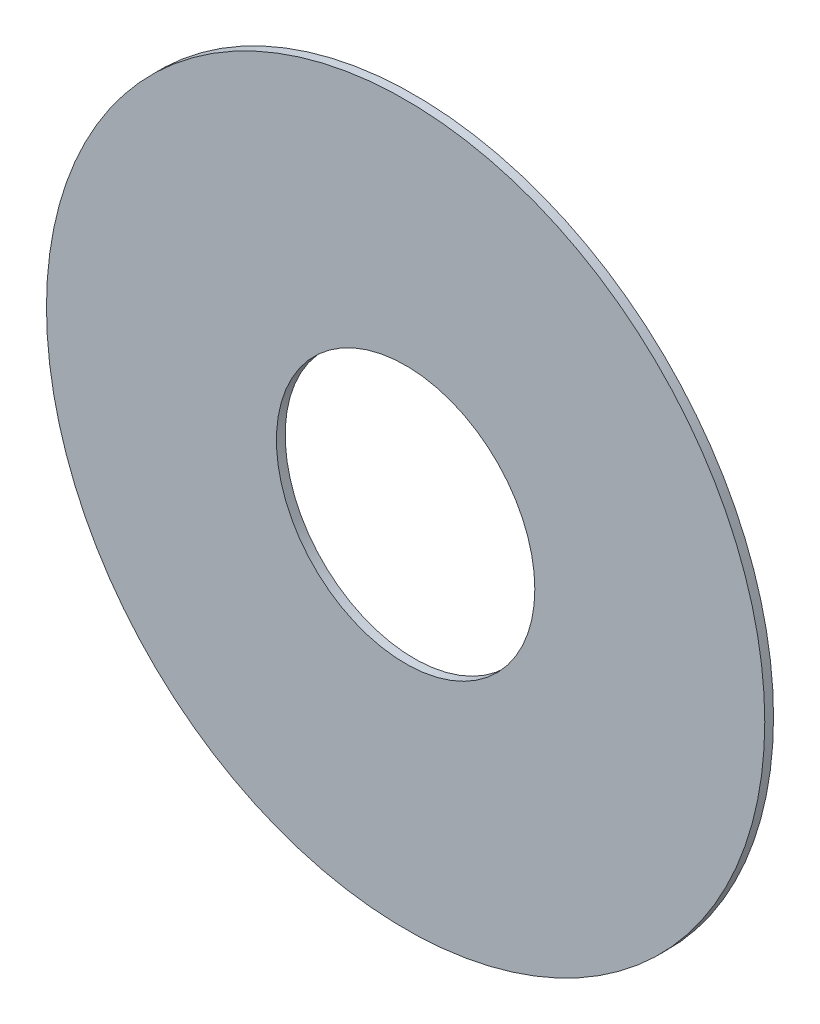
ISO-10303-21;
HEADER;
FILE_DESCRIPTION(('STEP AP214'),'2;1');
FILE_NAME('part.step','',(''),(''),'','','');
FILE_SCHEMA(('AUTOMOTIVE_DESIGN { 1 0 10303 214 1 1 1 1 }'));
ENDSEC;
DATA;
#1=APPLICATION_CONTEXT('core data for automotive mechanical design processes');
#2=APPLICATION_PROTOCOL_DEFINITION('international standard','automotive_design',2000,#1);
#3=PRODUCT_CONTEXT('',#1,'mechanical');
#4=PRODUCT('Part','Part','',(#3));
#5=PRODUCT_RELATED_PRODUCT_CATEGORY('part','',(#4));
#6=PRODUCT_DEFINITION_FORMATION('','',#4);
#7=PRODUCT_DEFINITION_CONTEXT('part definition',#1,'design');
#8=PRODUCT_DEFINITION('design','',#6,#7);
#9=PRODUCT_DEFINITION_SHAPE('','',#8);
#10=(LENGTH_UNIT() NAMED_UNIT(*) SI_UNIT(.MILLI.,.METRE.));
#11=(NAMED_UNIT(*) PLANE_ANGLE_UNIT() SI_UNIT($,.RADIAN.));
#12=(NAMED_UNIT(*) SI_UNIT($,.STERADIAN.) SOLID_ANGLE_UNIT());
#13=UNCERTAINTY_MEASURE_WITH_UNIT(LENGTH_MEASURE(1.E-05),#10,'distance_accuracy_value','');
#14=(GEOMETRIC_REPRESENTATION_CONTEXT(3) GLOBAL_UNCERTAINTY_ASSIGNED_CONTEXT((#13)) GLOBAL_UNIT_ASSIGNED_CONTEXT((#10,
#11,#12)) REPRESENTATION_CONTEXT('',''));
#15=CARTESIAN_POINT('',(0.,0.,0.));
#16=DIRECTION('',(0.,0.,1.));
#17=DIRECTION('',(1.,0.,0.));
#18=AXIS2_PLACEMENT_3D('',#15,#16,#17);
#19=CARTESIAN_POINT('',(0.,0.,-40.5));
#20=DIRECTION('',(0.,0.,1.));
#21=DIRECTION('',(1.,0.,0.));
#22=AXIS2_PLACEMENT_3D('',#19,#20,#21);
#23=PLANE('',#22);
#24=CARTESIAN_POINT('',(0.,0.,-40.5));
#25=DIRECTION('',(0.,0.,1.));
#26=DIRECTION('',(1.,0.,0.));
#27=AXIS2_PLACEMENT_3D('',#24,#25,#26);
#28=CIRCLE('',#27,82.);
#29=CARTESIAN_POINT('',(82.,0.,-40.5));
#30=VERTEX_POINT('',#29);
#31=EDGE_CURVE('E10',#30,#30,#28,.T.);
#32=ORIENTED_EDGE('',*,*,#31,.T.);
#33=EDGE_LOOP('',(#32));
#34=FACE_BOUND('',#33,.T.);
#35=CARTESIAN_POINT('',(0.,0.,-40.5));
#36=DIRECTION('',(0.,0.,1.));
#37=DIRECTION('',(1.,0.,0.));
#38=AXIS2_PLACEMENT_3D('',#35,#36,#37);
#39=CIRCLE('',#38,29.5);
#40=CARTESIAN_POINT('',(29.5,0.,-40.5));
#41=VERTEX_POINT('',#40);
#42=EDGE_CURVE('E46',#41,#41,#39,.T.);
#43=ORIENTED_EDGE('',*,*,#42,.F.);
#44=EDGE_LOOP('',(#43));
#45=FACE_BOUND('',#44,.T.);
#46=ADVANCED_FACE('F35',(#34,#45),#23,.T.);
#47=CARTESIAN_POINT('',(0.,0.,-42.5));
#48=DIRECTION('',(0.,0.,1.));
#49=DIRECTION('',(1.,0.,0.));
#50=AXIS2_PLACEMENT_3D('',#47,#48,#49);
#51=PLANE('',#50);
#52=CARTESIAN_POINT('',(0.,0.,-42.5));
#53=DIRECTION('',(0.,0.,1.));
#54=DIRECTION('',(1.,0.,0.));
#55=AXIS2_PLACEMENT_3D('',#52,#53,#54);
#56=CIRCLE('',#55,82.);
#57=CARTESIAN_POINT('',(82.,0.,-42.5));
#58=VERTEX_POINT('',#57);
#59=EDGE_CURVE('E39',#58,#58,#56,.T.);
#60=ORIENTED_EDGE('',*,*,#59,.F.);
#61=EDGE_LOOP('',(#60));
#62=FACE_BOUND('',#61,.T.);
#63=CARTESIAN_POINT('',(0.,0.,-42.5));
#64=DIRECTION('',(0.,0.,1.));
#65=DIRECTION('',(1.,0.,0.));
#66=AXIS2_PLACEMENT_3D('',#63,#64,#65);
#67=CIRCLE('',#66,29.5);
#68=CARTESIAN_POINT('',(29.5,0.,-42.5));
#69=VERTEX_POINT('',#68);
#70=EDGE_CURVE('E48',#69,#69,#67,.T.);
#71=ORIENTED_EDGE('',*,*,#70,.T.);
#72=EDGE_LOOP('',(#71));
#73=FACE_BOUND('',#72,.T.);
#74=ADVANCED_FACE('F58',(#62,#73),#51,.F.);
#75=CARTESIAN_POINT('',(0.,0.,-40.5));
#76=DIRECTION('',(0.,0.,-1.));
#77=DIRECTION('',(-1.,0.,0.));
#78=AXIS2_PLACEMENT_3D('',#75,#76,#77);
#79=CYLINDRICAL_SURFACE('',#78,82.);
#80=ORIENTED_EDGE('',*,*,#31,.F.);
#81=EDGE_LOOP('',(#80));
#82=FACE_BOUND('',#81,.T.);
#83=ORIENTED_EDGE('',*,*,#59,.T.);
#84=EDGE_LOOP('',(#83));
#85=FACE_BOUND('',#84,.T.);
#86=ADVANCED_FACE('F37',(#82,#85),#79,.T.);
#87=CARTESIAN_POINT('',(0.,0.,-40.5));
#88=DIRECTION('',(0.,0.,-1.));
#89=DIRECTION('',(-1.,0.,0.));
#90=AXIS2_PLACEMENT_3D('',#87,#88,#89);
#91=CYLINDRICAL_SURFACE('',#90,29.5);
#92=ORIENTED_EDGE('',*,*,#42,.T.);
#93=EDGE_LOOP('',(#92));
#94=FACE_BOUND('',#93,.T.);
#95=ORIENTED_EDGE('',*,*,#70,.F.);
#96=EDGE_LOOP('',(#95));
#97=FACE_BOUND('',#96,.T.);
#98=ADVANCED_FACE('F54',(#94,#97),#91,.F.);
#99=CLOSED_SHELL('',(#46,#74,#86,#98));
#100=MANIFOLD_SOLID_BREP('B2',#99);
#101=ADVANCED_BREP_SHAPE_REPRESENTATION('',(#18,#100),#14);
#102=SHAPE_DEFINITION_REPRESENTATION(#9,#101);
ENDSEC;
END-ISO-10303-21;
